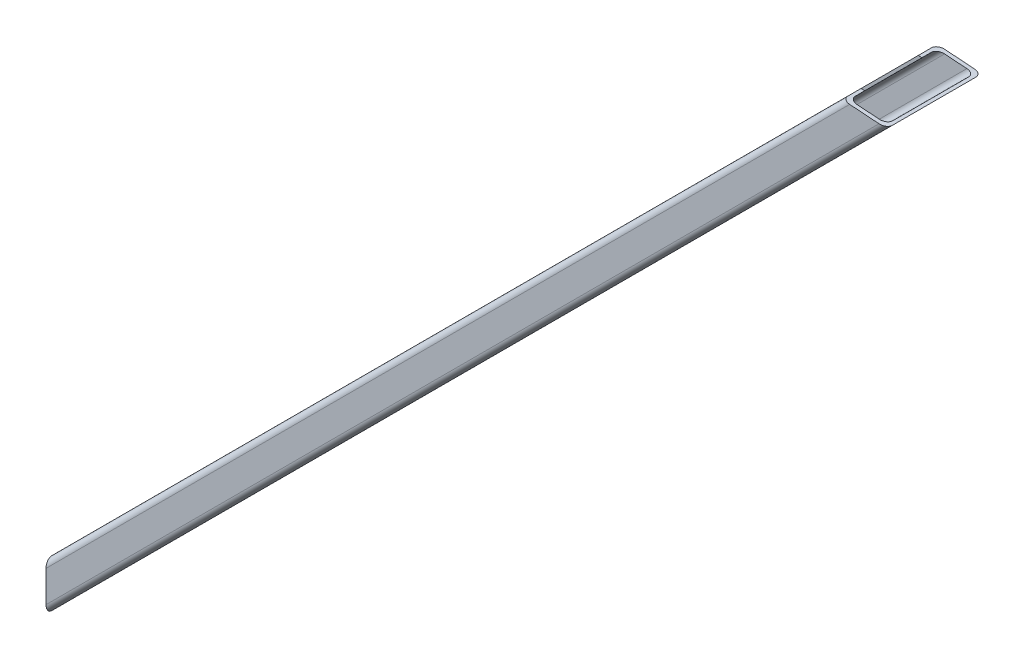
ISO-10303-21;
HEADER;
FILE_DESCRIPTION(('STEP AP214'),'2;1');
FILE_NAME('part.step','',(''),(''),'','','');
FILE_SCHEMA(('AUTOMOTIVE_DESIGN { 1 0 10303 214 1 1 1 1 }'));
ENDSEC;
DATA;
#1=APPLICATION_CONTEXT('core data for automotive mechanical design processes');
#2=APPLICATION_PROTOCOL_DEFINITION('international standard','automotive_design',2000,#1);
#3=PRODUCT_CONTEXT('',#1,'mechanical');
#4=PRODUCT('Part','Part','',(#3));
#5=PRODUCT_RELATED_PRODUCT_CATEGORY('part','',(#4));
#6=PRODUCT_DEFINITION_FORMATION('','',#4);
#7=PRODUCT_DEFINITION_CONTEXT('part definition',#1,'design');
#8=PRODUCT_DEFINITION('design','',#6,#7);
#9=PRODUCT_DEFINITION_SHAPE('','',#8);
#10=(LENGTH_UNIT() NAMED_UNIT(*) SI_UNIT(.MILLI.,.METRE.));
#11=(NAMED_UNIT(*) PLANE_ANGLE_UNIT() SI_UNIT($,.RADIAN.));
#12=(NAMED_UNIT(*) SI_UNIT($,.STERADIAN.) SOLID_ANGLE_UNIT());
#13=UNCERTAINTY_MEASURE_WITH_UNIT(LENGTH_MEASURE(1.E-05),#10,'distance_accuracy_value','');
#14=(GEOMETRIC_REPRESENTATION_CONTEXT(3) GLOBAL_UNCERTAINTY_ASSIGNED_CONTEXT((#13)) GLOBAL_UNIT_ASSIGNED_CONTEXT((#10,
#11,#12)) REPRESENTATION_CONTEXT('',''));
#15=CARTESIAN_POINT('',(0.,0.,0.));
#16=DIRECTION('',(0.,0.,1.));
#17=DIRECTION('',(1.,0.,0.));
#18=AXIS2_PLACEMENT_3D('',#15,#16,#17);
#19=CARTESIAN_POINT('',(951.319177060219,976.319177060221,-50.));
#20=DIRECTION('',(0.,0.,1.));
#21=DIRECTION('',(1.,0.,0.));
#22=AXIS2_PLACEMENT_3D('',#19,#20,#21);
#23=PLANE('',#22);
#24=DIRECTION('',(0.,1.,0.));
#25=VECTOR('',#24,1.);
#26=CARTESIAN_POINT('',(0.,25.,-50.));
#27=LINE('',#26,#25);
#28=CARTESIAN_POINT('',(0.,-16.5147186257614,-50.));
#29=VERTEX_POINT('',#28);
#30=CARTESIAN_POINT('',(0.,16.5147186257613,-50.));
#31=VERTEX_POINT('',#30);
#32=EDGE_CURVE('E201',#29,#31,#27,.T.);
#33=ORIENTED_EDGE('',*,*,#32,.T.);
#34=DIRECTION('',(-0.707106781186547,-0.707106781186549,0.));
#35=VECTOR('',#34,1.);
#36=CARTESIAN_POINT('',(955.561817747338,972.076536373102,-50.));
#37=LINE('',#36,#35);
#38=CARTESIAN_POINT('',(843.994443251335,860.509161877098,-50.));
#39=VERTEX_POINT('',#38);
#40=EDGE_CURVE('E260',#31,#39,#37,.F.);
#41=ORIENTED_EDGE('',*,*,#40,.T.);
#42=DIRECTION('',(-0.997546761100416,0.0700032814807309,0.));
#43=VECTOR('',#42,1.);
#44=CARTESIAN_POINT('',(942.706044073176,853.582031994864,-50.));
#45=LINE('',#44,#43);
#46=CARTESIAN_POINT('',(874.858015765053,858.343297139294,-50.));
#47=VERTEX_POINT('',#46);
#48=EDGE_CURVE('E183',#47,#39,#45,.T.);
#49=ORIENTED_EDGE('',*,*,#48,.F.);
#50=DIRECTION('',(-0.707106781186547,-0.707106781186549,0.));
#51=VECTOR('',#50,1.);
#52=CARTESIAN_POINT('',(972.076536373099,955.561817747341,-50.));
#53=LINE('',#52,#51);
#54=EDGE_CURVE('E257',#47,#29,#53,.T.);
#55=ORIENTED_EDGE('',*,*,#54,.T.);
#56=EDGE_LOOP('',(#33,#41,#49,#55));
#57=FACE_BOUND('',#56,.T.);
#58=ADVANCED_FACE('F33',(#57),#23,.F.);
#59=CARTESIAN_POINT('',(951.319177060219,976.319177060221,-30.));
#60=DIRECTION('',(0.707106781186549,-0.707106781186547,0.));
#61=DIRECTION('',(0.707106781186547,0.707106781186549,0.));
#62=AXIS2_PLACEMENT_3D('',#59,#60,#61);
#63=PLANE('',#62);
#64=DIRECTION('',(0.,0.,1.));
#65=VECTOR('',#64,1.);
#66=CARTESIAN_POINT('',(836.065573770489,861.065573770491,-29.9999999999999));
#67=LINE('',#66,#65);
#68=CARTESIAN_POINT('',(836.065573770489,861.065573770491,-44.));
#69=VERTEX_POINT('',#68);
#70=CARTESIAN_POINT('',(836.065573770489,861.065573770491,-30.));
#71=VERTEX_POINT('',#70);
#72=EDGE_CURVE('E170',#69,#71,#67,.T.);
#73=ORIENTED_EDGE('',*,*,#72,.F.);
#74=DIRECTION('',(-0.707106781186547,-0.707106781186549,0.));
#75=VECTOR('',#74,1.);
#76=CARTESIAN_POINT('',(951.319177060219,976.319177060221,-44.));
#77=LINE('',#76,#75);
#78=CARTESIAN_POINT('',(0.,25.,-44.));
#79=VERTEX_POINT('',#78);
#80=EDGE_CURVE('E255',#69,#79,#77,.T.);
#81=ORIENTED_EDGE('',*,*,#80,.T.);
#82=DIRECTION('',(0.,0.,1.));
#83=VECTOR('',#82,1.);
#84=CARTESIAN_POINT('',(0.,25.,-30.));
#85=LINE('',#84,#83);
#86=CARTESIAN_POINT('',(0.,25.,-30.));
#87=VERTEX_POINT('',#86);
#88=EDGE_CURVE('E197',#79,#87,#85,.T.);
#89=ORIENTED_EDGE('',*,*,#88,.T.);
#90=DIRECTION('',(-0.707106781186547,-0.707106781186549,0.));
#91=VECTOR('',#90,1.);
#92=CARTESIAN_POINT('',(951.319177060219,976.319177060221,-30.));
#93=LINE('',#92,#91);
#94=EDGE_CURVE('E190',#71,#87,#93,.T.);
#95=ORIENTED_EDGE('',*,*,#94,.F.);
#96=EDGE_LOOP('',(#73,#81,#89,#95));
#97=FACE_BOUND('',#96,.T.);
#98=ADVANCED_FACE('F195',(#97),#63,.F.);
#99=CARTESIAN_POINT('',(951.319177060219,976.319177060221,-30.));
#100=DIRECTION('',(0.,0.,-1.));
#101=DIRECTION('',(-1.,0.,0.));
#102=AXIS2_PLACEMENT_3D('',#99,#100,#101);
#103=PLANE('',#102);
#104=DIRECTION('',(0.997546761100416,-0.0700032814807309,0.));
#105=VECTOR('',#104,1.);
#106=CARTESIAN_POINT('',(942.706044073176,853.582031994864,-30.));
#107=LINE('',#106,#105);
#108=CARTESIAN_POINT('',(839.803278688521,860.803278688524,-30.));
#109=VERTEX_POINT('',#108);
#110=EDGE_CURVE('E175',#71,#109,#107,.T.);
#111=ORIENTED_EDGE('',*,*,#110,.F.);
#112=ORIENTED_EDGE('',*,*,#94,.T.);
#113=DIRECTION('',(0.,-1.,0.));
#114=VECTOR('',#113,1.);
#115=CARTESIAN_POINT('',(0.,25.,-30.));
#116=LINE('',#115,#114);
#117=CARTESIAN_POINT('',(0.,21.,-30.));
#118=VERTEX_POINT('',#117);
#119=EDGE_CURVE('E198',#87,#118,#116,.T.);
#120=ORIENTED_EDGE('',*,*,#119,.T.);
#121=DIRECTION('',(-0.707106781186547,-0.707106781186549,0.));
#122=VECTOR('',#121,1.);
#123=CARTESIAN_POINT('',(951.319177060219,972.319177060221,-30.));
#124=LINE('',#123,#122);
#125=EDGE_CURVE('E192',#109,#118,#124,.T.);
#126=ORIENTED_EDGE('',*,*,#125,.F.);
#127=EDGE_LOOP('',(#111,#112,#120,#126));
#128=FACE_BOUND('',#127,.T.);
#129=ADVANCED_FACE('F188',(#128),#103,.F.);
#130=CARTESIAN_POINT('',(951.319177060219,972.319177060221,-30.));
#131=DIRECTION('',(-0.707106781186549,0.707106781186547,0.));
#132=DIRECTION('',(-0.707106781186547,-0.707106781186549,0.));
#133=AXIS2_PLACEMENT_3D('',#130,#131,#132);
#134=PLANE('',#133);
#135=DIRECTION('',(0.,0.,-1.));
#136=VECTOR('',#135,1.);
#137=CARTESIAN_POINT('',(0.,21.,-30.));
#138=LINE('',#137,#136);
#139=CARTESIAN_POINT('',(0.,21.,-40.));
#140=VERTEX_POINT('',#139);
#141=EDGE_CURVE('E208',#118,#140,#138,.T.);
#142=ORIENTED_EDGE('',*,*,#141,.T.);
#143=DIRECTION('',(-0.707106781186547,-0.707106781186549,0.));
#144=VECTOR('',#143,1.);
#145=CARTESIAN_POINT('',(839.803278688521,860.803278688524,-40.));
#146=LINE('',#145,#144);
#147=CARTESIAN_POINT('',(839.803278688521,860.803278688524,-40.));
#148=VERTEX_POINT('',#147);
#149=EDGE_CURVE('E223',#140,#148,#146,.F.);
#150=ORIENTED_EDGE('',*,*,#149,.T.);
#151=DIRECTION('',(0.,0.,-1.));
#152=VECTOR('',#151,1.);
#153=CARTESIAN_POINT('',(839.803278688521,860.803278688524,-29.9999999999999));
#154=LINE('',#153,#152);
#155=EDGE_CURVE('E193',#109,#148,#154,.T.);
#156=ORIENTED_EDGE('',*,*,#155,.F.);
#157=ORIENTED_EDGE('',*,*,#125,.T.);
#158=EDGE_LOOP('',(#142,#150,#156,#157));
#159=FACE_BOUND('',#158,.T.);
#160=ADVANCED_FACE('F383',(#159),#134,.F.);
#161=CARTESIAN_POINT('',(951.319177060219,972.319177060221,-46.));
#162=DIRECTION('',(0.,0.,-1.));
#163=DIRECTION('',(-1.,0.,0.));
#164=AXIS2_PLACEMENT_3D('',#161,#162,#163);
#165=PLANE('',#164);
#166=DIRECTION('',(0.997546761100416,-0.0700032814807309,0.));
#167=VECTOR('',#166,1.);
#168=CARTESIAN_POINT('',(942.985370260006,853.562430157192,-46.));
#169=LINE('',#168,#167);
#170=CARTESIAN_POINT('',(847.732148169367,860.246866795131,-46.));
#171=VERTEX_POINT('',#170);
#172=CARTESIAN_POINT('',(871.12031084702,858.605592221261,-46.));
#173=VERTEX_POINT('',#172);
#174=EDGE_CURVE('E309',#171,#173,#169,.T.);
#175=ORIENTED_EDGE('',*,*,#174,.F.);
#176=DIRECTION('',(-0.707106781186547,-0.707106781186549,0.));
#177=VECTOR('',#176,1.);
#178=CARTESIAN_POINT('',(4.24264068711932,16.7573593128807,-46.));
#179=LINE('',#178,#177);
#180=CARTESIAN_POINT('',(0.,12.5147186257614,-46.));
#181=VERTEX_POINT('',#180);
#182=EDGE_CURVE('E219',#171,#181,#179,.T.);
#183=ORIENTED_EDGE('',*,*,#182,.T.);
#184=DIRECTION('',(0.,-1.,0.));
#185=VECTOR('',#184,1.);
#186=CARTESIAN_POINT('',(0.,21.,-46.));
#187=LINE('',#186,#185);
#188=CARTESIAN_POINT('',(0.,-12.5147186257614,-46.));
#189=VERTEX_POINT('',#188);
#190=EDGE_CURVE('E293',#181,#189,#187,.T.);
#191=ORIENTED_EDGE('',*,*,#190,.T.);
#192=DIRECTION('',(-0.707106781186547,-0.707106781186549,0.));
#193=VECTOR('',#192,1.);
#194=CARTESIAN_POINT('',(874.806539640746,862.291821014987,-46.));
#195=LINE('',#194,#193);
#196=EDGE_CURVE('E217',#189,#173,#195,.F.);
#197=ORIENTED_EDGE('',*,*,#196,.T.);
#198=EDGE_LOOP('',(#175,#183,#191,#197));
#199=FACE_BOUND('',#198,.T.);
#200=ADVANCED_FACE('F390',(#199),#165,.F.);
#201=CARTESIAN_POINT('',(951.319177060219,930.319177060221,46.));
#202=DIRECTION('',(0.707106781186549,-0.707106781186547,0.));
#203=DIRECTION('',(0.707106781186547,0.707106781186549,0.));
#204=AXIS2_PLACEMENT_3D('',#201,#202,#203);
#205=PLANE('',#204);
#206=DIRECTION('',(0.,0.,1.));
#207=VECTOR('',#206,1.);
#208=CARTESIAN_POINT('',(879.049180327866,858.049180327868,46.));
#209=LINE('',#208,#207);
#210=CARTESIAN_POINT('',(879.049180327866,858.049180327868,-40.));
#211=VERTEX_POINT('',#210);
#212=CARTESIAN_POINT('',(879.049180327866,858.049180327868,40.));
#213=VERTEX_POINT('',#212);
#214=EDGE_CURVE('E301',#211,#213,#209,.T.);
#215=ORIENTED_EDGE('',*,*,#214,.F.);
#216=DIRECTION('',(-0.707106781186547,-0.707106781186549,0.));
#217=VECTOR('',#216,1.);
#218=CARTESIAN_POINT('',(0.,-21.0000000000001,-40.));
#219=LINE('',#218,#217);
#220=CARTESIAN_POINT('',(0.,-21.,-40.));
#221=VERTEX_POINT('',#220);
#222=EDGE_CURVE('E268',#211,#221,#219,.T.);
#223=ORIENTED_EDGE('',*,*,#222,.T.);
#224=DIRECTION('',(0.,0.,1.));
#225=VECTOR('',#224,1.);
#226=CARTESIAN_POINT('',(0.,-21.,46.));
#227=LINE('',#226,#225);
#228=CARTESIAN_POINT('',(0.,-21.,40.));
#229=VERTEX_POINT('',#228);
#230=EDGE_CURVE('E286',#221,#229,#227,.T.);
#231=ORIENTED_EDGE('',*,*,#230,.T.);
#232=DIRECTION('',(-0.707106781186547,-0.707106781186549,0.));
#233=VECTOR('',#232,1.);
#234=CARTESIAN_POINT('',(879.049180327866,858.049180327868,40.));
#235=LINE('',#234,#233);
#236=EDGE_CURVE('E48',#229,#213,#235,.F.);
#237=ORIENTED_EDGE('',*,*,#236,.T.);
#238=EDGE_LOOP('',(#215,#223,#231,#237));
#239=FACE_BOUND('',#238,.T.);
#240=ADVANCED_FACE('F291',(#239),#205,.F.);
#241=CARTESIAN_POINT('',(951.319177060219,972.319177060221,46.));
#242=DIRECTION('',(0.,0.,1.));
#243=DIRECTION('',(1.,0.,0.));
#244=AXIS2_PLACEMENT_3D('',#241,#242,#243);
#245=PLANE('',#244);
#246=DIRECTION('',(0.,1.,0.));
#247=VECTOR('',#246,1.);
#248=CARTESIAN_POINT('',(0.,21.,46.));
#249=LINE('',#248,#247);
#250=CARTESIAN_POINT('',(0.,-12.5147186257615,46.));
#251=VERTEX_POINT('',#250);
#252=CARTESIAN_POINT('',(0.,12.5147186257613,46.));
#253=VERTEX_POINT('',#252);
#254=EDGE_CURVE('E288',#251,#253,#249,.T.);
#255=ORIENTED_EDGE('',*,*,#254,.T.);
#256=DIRECTION('',(-0.707106781186547,-0.707106781186549,0.));
#257=VECTOR('',#256,1.);
#258=CARTESIAN_POINT('',(844.045919375641,856.560638001405,46.));
#259=LINE('',#258,#257);
#260=CARTESIAN_POINT('',(847.732148169367,860.246866795131,46.));
#261=VERTEX_POINT('',#260);
#262=EDGE_CURVE('E231',#253,#261,#259,.F.);
#263=ORIENTED_EDGE('',*,*,#262,.T.);
#264=DIRECTION('',(-0.997546761100416,0.0700032814807309,0.));
#265=VECTOR('',#264,1.);
#266=CARTESIAN_POINT('',(942.985370260006,853.562430157192,46.));
#267=LINE('',#266,#265);
#268=CARTESIAN_POINT('',(871.12031084702,858.605592221261,46.));
#269=VERTEX_POINT('',#268);
#270=EDGE_CURVE('E299',#269,#261,#267,.T.);
#271=ORIENTED_EDGE('',*,*,#270,.F.);
#272=DIRECTION('',(-0.707106781186547,-0.707106781186549,0.));
#273=VECTOR('',#272,1.);
#274=CARTESIAN_POINT('',(-4.24264068711944,-16.7573593128809,46.));
#275=LINE('',#274,#273);
#276=EDGE_CURVE('E228',#269,#251,#275,.T.);
#277=ORIENTED_EDGE('',*,*,#276,.T.);
#278=EDGE_LOOP('',(#255,#263,#271,#277));
#279=FACE_BOUND('',#278,.T.);
#280=ADVANCED_FACE('F303',(#279),#245,.F.);
#281=CARTESIAN_POINT('',(951.319177060219,972.319177060221,46.));
#282=DIRECTION('',(-0.707106781186549,0.707106781186547,0.));
#283=DIRECTION('',(-0.707106781186547,-0.707106781186549,0.));
#284=AXIS2_PLACEMENT_3D('',#281,#282,#283);
#285=PLANE('',#284);
#286=DIRECTION('',(0.,0.,-1.));
#287=VECTOR('',#286,1.);
#288=CARTESIAN_POINT('',(839.803278688521,860.803278688524,46.0000000000001));
#289=LINE('',#288,#287);
#290=CARTESIAN_POINT('',(839.803278688521,860.803278688524,40.));
#291=VERTEX_POINT('',#290);
#292=CARTESIAN_POINT('',(839.803278688522,860.803278688524,30.));
#293=VERTEX_POINT('',#292);
#294=EDGE_CURVE('E305',#291,#293,#289,.T.);
#295=ORIENTED_EDGE('',*,*,#294,.F.);
#296=DIRECTION('',(-0.707106781186547,-0.707106781186549,0.));
#297=VECTOR('',#296,1.);
#298=CARTESIAN_POINT('',(0.,21.0000000000001,40.));
#299=LINE('',#298,#297);
#300=CARTESIAN_POINT('',(0.,21.,40.));
#301=VERTEX_POINT('',#300);
#302=EDGE_CURVE('E225',#291,#301,#299,.T.);
#303=ORIENTED_EDGE('',*,*,#302,.T.);
#304=DIRECTION('',(0.,0.,-1.));
#305=VECTOR('',#304,1.);
#306=CARTESIAN_POINT('',(0.,21.,46.));
#307=LINE('',#306,#305);
#308=CARTESIAN_POINT('',(0.,21.,30.));
#309=VERTEX_POINT('',#308);
#310=EDGE_CURVE('E213',#301,#309,#307,.T.);
#311=ORIENTED_EDGE('',*,*,#310,.T.);
#312=DIRECTION('',(-0.707106781186547,-0.707106781186549,0.));
#313=VECTOR('',#312,1.);
#314=CARTESIAN_POINT('',(951.319177060219,972.319177060221,30.));
#315=LINE('',#314,#313);
#316=EDGE_CURVE('E209',#293,#309,#315,.T.);
#317=ORIENTED_EDGE('',*,*,#316,.F.);
#318=EDGE_LOOP('',(#295,#303,#311,#317));
#319=FACE_BOUND('',#318,.T.);
#320=ADVANCED_FACE('F353',(#319),#285,.F.);
#321=CARTESIAN_POINT('',(951.319177060219,976.319177060221,30.));
#322=DIRECTION('',(0.,0.,1.));
#323=DIRECTION('',(1.,0.,0.));
#324=AXIS2_PLACEMENT_3D('',#321,#322,#323);
#325=PLANE('',#324);
#326=DIRECTION('',(-0.997546761100416,0.0700032814807309,0.));
#327=VECTOR('',#326,1.);
#328=CARTESIAN_POINT('',(942.706044073176,853.582031994864,30.));
#329=LINE('',#328,#327);
#330=CARTESIAN_POINT('',(836.065573770489,861.065573770491,30.));
#331=VERTEX_POINT('',#330);
#332=EDGE_CURVE('E307',#293,#331,#329,.T.);
#333=ORIENTED_EDGE('',*,*,#332,.F.);
#334=ORIENTED_EDGE('',*,*,#316,.T.);
#335=DIRECTION('',(0.,1.,0.));
#336=VECTOR('',#335,1.);
#337=CARTESIAN_POINT('',(0.,25.,30.));
#338=LINE('',#337,#336);
#339=CARTESIAN_POINT('',(0.,25.,30.));
#340=VERTEX_POINT('',#339);
#341=EDGE_CURVE('E212',#309,#340,#338,.T.);
#342=ORIENTED_EDGE('',*,*,#341,.T.);
#343=DIRECTION('',(-0.707106781186547,-0.707106781186549,0.));
#344=VECTOR('',#343,1.);
#345=CARTESIAN_POINT('',(951.319177060219,976.319177060221,30.));
#346=LINE('',#345,#344);
#347=EDGE_CURVE('E214',#331,#340,#346,.T.);
#348=ORIENTED_EDGE('',*,*,#347,.F.);
#349=EDGE_LOOP('',(#333,#334,#342,#348));
#350=FACE_BOUND('',#349,.T.);
#351=ADVANCED_FACE('F350',(#350),#325,.F.);
#352=CARTESIAN_POINT('',(951.319177060219,976.319177060221,50.));
#353=DIRECTION('',(0.707106781186549,-0.707106781186547,0.));
#354=DIRECTION('',(0.707106781186547,0.707106781186549,0.));
#355=AXIS2_PLACEMENT_3D('',#352,#353,#354);
#356=PLANE('',#355);
#357=DIRECTION('',(0.,0.,1.));
#358=VECTOR('',#357,1.);
#359=CARTESIAN_POINT('',(0.,25.,50.));
#360=LINE('',#359,#358);
#361=CARTESIAN_POINT('',(0.,25.,44.));
#362=VERTEX_POINT('',#361);
#363=EDGE_CURVE('E216',#340,#362,#360,.T.);
#364=ORIENTED_EDGE('',*,*,#363,.T.);
#365=DIRECTION('',(-0.707106781186547,-0.707106781186549,0.));
#366=VECTOR('',#365,1.);
#367=CARTESIAN_POINT('',(951.319177060219,976.319177060221,44.));
#368=LINE('',#367,#366);
#369=CARTESIAN_POINT('',(836.065573770489,861.065573770491,44.));
#370=VERTEX_POINT('',#369);
#371=EDGE_CURVE('E246',#362,#370,#368,.F.);
#372=ORIENTED_EDGE('',*,*,#371,.T.);
#373=DIRECTION('',(0.,0.,1.));
#374=VECTOR('',#373,1.);
#375=CARTESIAN_POINT('',(836.065573770489,861.065573770491,50.0000000000001));
#376=LINE('',#375,#374);
#377=EDGE_CURVE('E342',#331,#370,#376,.T.);
#378=ORIENTED_EDGE('',*,*,#377,.F.);
#379=ORIENTED_EDGE('',*,*,#347,.T.);
#380=EDGE_LOOP('',(#364,#372,#378,#379));
#381=FACE_BOUND('',#380,.T.);
#382=ADVANCED_FACE('F359',(#381),#356,.F.);
#383=CARTESIAN_POINT('',(951.319177060219,976.319177060221,50.));
#384=DIRECTION('',(0.,0.,-1.));
#385=DIRECTION('',(-1.,0.,0.));
#386=AXIS2_PLACEMENT_3D('',#383,#384,#385);
#387=PLANE('',#386);
#388=DIRECTION('',(0.997546761100416,-0.0700032814807309,0.));
#389=VECTOR('',#388,1.);
#390=CARTESIAN_POINT('',(942.706044073176,853.582031994864,50.));
#391=LINE('',#390,#389);
#392=CARTESIAN_POINT('',(843.994443251335,860.509161877098,50.));
#393=VERTEX_POINT('',#392);
#394=CARTESIAN_POINT('',(874.858015765053,858.343297139294,50.));
#395=VERTEX_POINT('',#394);
#396=EDGE_CURVE('E220',#393,#395,#391,.T.);
#397=ORIENTED_EDGE('',*,*,#396,.F.);
#398=DIRECTION('',(-0.707106781186547,-0.707106781186549,0.));
#399=VECTOR('',#398,1.);
#400=CARTESIAN_POINT('',(955.561817747338,972.076536373102,50.));
#401=LINE('',#400,#399);
#402=CARTESIAN_POINT('',(0.,16.5147186257614,50.));
#403=VERTEX_POINT('',#402);
#404=EDGE_CURVE('E235',#393,#403,#401,.T.);
#405=ORIENTED_EDGE('',*,*,#404,.T.);
#406=DIRECTION('',(0.,-1.,0.));
#407=VECTOR('',#406,1.);
#408=CARTESIAN_POINT('',(0.,25.,50.));
#409=LINE('',#408,#407);
#410=CARTESIAN_POINT('',(0.,-16.5147186257614,50.));
#411=VERTEX_POINT('',#410);
#412=EDGE_CURVE('E320',#403,#411,#409,.T.);
#413=ORIENTED_EDGE('',*,*,#412,.T.);
#414=DIRECTION('',(-0.707106781186547,-0.707106781186549,0.));
#415=VECTOR('',#414,1.);
#416=CARTESIAN_POINT('',(972.076536373099,955.561817747341,50.));
#417=LINE('',#416,#415);
#418=EDGE_CURVE('E233',#411,#395,#417,.F.);
#419=ORIENTED_EDGE('',*,*,#418,.T.);
#420=EDGE_LOOP('',(#397,#405,#413,#419));
#421=FACE_BOUND('',#420,.T.);
#422=ADVANCED_FACE('F366',(#421),#387,.F.);
#423=CARTESIAN_POINT('',(951.319177060219,926.319177060221,50.));
#424=DIRECTION('',(-0.707106781186549,0.707106781186547,0.));
#425=DIRECTION('',(-0.707106781186547,-0.707106781186549,0.));
#426=AXIS2_PLACEMENT_3D('',#423,#424,#425);
#427=PLANE('',#426);
#428=DIRECTION('',(0.,0.,-1.));
#429=VECTOR('',#428,1.);
#430=CARTESIAN_POINT('',(0.,-25.,50.));
#431=LINE('',#430,#429);
#432=CARTESIAN_POINT('',(0.,-25.,44.));
#433=VERTEX_POINT('',#432);
#434=CARTESIAN_POINT('',(0.,-25.,-44.));
#435=VERTEX_POINT('',#434);
#436=EDGE_CURVE('E316',#433,#435,#431,.T.);
#437=ORIENTED_EDGE('',*,*,#436,.T.);
#438=DIRECTION('',(-0.707106781186547,-0.707106781186549,0.));
#439=VECTOR('',#438,1.);
#440=CARTESIAN_POINT('',(951.319177060219,926.319177060221,-44.));
#441=LINE('',#440,#439);
#442=CARTESIAN_POINT('',(882.786885245899,857.786885245901,-44.));
#443=VERTEX_POINT('',#442);
#444=EDGE_CURVE('E265',#435,#443,#441,.F.);
#445=ORIENTED_EDGE('',*,*,#444,.T.);
#446=DIRECTION('',(0.,0.,-1.));
#447=VECTOR('',#446,1.);
#448=CARTESIAN_POINT('',(882.786885245899,857.786885245901,50.));
#449=LINE('',#448,#447);
#450=CARTESIAN_POINT('',(882.786885245899,857.786885245901,44.));
#451=VERTEX_POINT('',#450);
#452=EDGE_CURVE('E205',#451,#443,#449,.T.);
#453=ORIENTED_EDGE('',*,*,#452,.F.);
#454=DIRECTION('',(-0.707106781186547,-0.707106781186549,0.));
#455=VECTOR('',#454,1.);
#456=CARTESIAN_POINT('',(951.319177060219,926.319177060221,44.));
#457=LINE('',#456,#455);
#458=EDGE_CURVE('E262',#451,#433,#457,.T.);
#459=ORIENTED_EDGE('',*,*,#458,.T.);
#460=EDGE_LOOP('',(#437,#445,#453,#459));
#461=FACE_BOUND('',#460,.T.);
#462=ADVANCED_FACE('F370',(#461),#427,.F.);
#463=CARTESIAN_POINT('',(0.,0.,0.));
#464=DIRECTION('',(1.,0.,0.));
#465=DIRECTION('',(0.,0.,-1.));
#466=AXIS2_PLACEMENT_3D('',#463,#464,#465);
#467=PLANE('',#466);
#468=ORIENTED_EDGE('',*,*,#412,.F.);
#469=CARTESIAN_POINT('',(0.,16.5147186257614,44.));
#470=DIRECTION('',(1.,0.,0.));
#471=DIRECTION('',(0.,-1.,0.));
#472=AXIS2_PLACEMENT_3D('',#469,#470,#471);
#473=ELLIPSE('',#472,8.48528137423858,6.);
#474=EDGE_CURVE('E244',#403,#362,#473,.F.);
#475=ORIENTED_EDGE('',*,*,#474,.T.);
#476=ORIENTED_EDGE('',*,*,#363,.F.);
#477=ORIENTED_EDGE('',*,*,#341,.F.);
#478=ORIENTED_EDGE('',*,*,#310,.F.);
#479=CARTESIAN_POINT('',(0.,12.5147186257614,40.));
#480=DIRECTION('',(1.,0.,0.));
#481=DIRECTION('',(0.,1.,0.));
#482=AXIS2_PLACEMENT_3D('',#479,#480,#481);
#483=ELLIPSE('',#482,8.48528137423858,6.);
#484=EDGE_CURVE('E275',#301,#253,#483,.T.);
#485=ORIENTED_EDGE('',*,*,#484,.T.);
#486=ORIENTED_EDGE('',*,*,#254,.F.);
#487=CARTESIAN_POINT('',(0.,-12.5147186257615,40.));
#488=DIRECTION('',(1.,0.,0.));
#489=DIRECTION('',(0.,1.,0.));
#490=AXIS2_PLACEMENT_3D('',#487,#488,#489);
#491=ELLIPSE('',#490,8.48528137423858,6.);
#492=EDGE_CURVE('E41',#251,#229,#491,.T.);
#493=ORIENTED_EDGE('',*,*,#492,.T.);
#494=ORIENTED_EDGE('',*,*,#230,.F.);
#495=CARTESIAN_POINT('',(-1.11022302462516E-13,-12.5147186257615,-40.));
#496=DIRECTION('',(1.,0.,0.));
#497=DIRECTION('',(0.,1.,0.));
#498=AXIS2_PLACEMENT_3D('',#495,#496,#497);
#499=ELLIPSE('',#498,8.48528137423858,6.);
#500=EDGE_CURVE('E279',#221,#189,#499,.T.);
#501=ORIENTED_EDGE('',*,*,#500,.T.);
#502=ORIENTED_EDGE('',*,*,#190,.F.);
#503=CARTESIAN_POINT('',(0.,12.5147186257614,-40.));
#504=DIRECTION('',(1.,0.,0.));
#505=DIRECTION('',(0.,1.,0.));
#506=AXIS2_PLACEMENT_3D('',#503,#504,#505);
#507=ELLIPSE('',#506,8.48528137423858,6.);
#508=EDGE_CURVE('E271',#181,#140,#507,.T.);
#509=ORIENTED_EDGE('',*,*,#508,.T.);
#510=ORIENTED_EDGE('',*,*,#141,.F.);
#511=ORIENTED_EDGE('',*,*,#119,.F.);
#512=ORIENTED_EDGE('',*,*,#88,.F.);
#513=CARTESIAN_POINT('',(0.,16.5147186257614,-44.));
#514=DIRECTION('',(1.,0.,0.));
#515=DIRECTION('',(0.,-1.,0.));
#516=AXIS2_PLACEMENT_3D('',#513,#514,#515);
#517=ELLIPSE('',#516,8.48528137423858,6.);
#518=EDGE_CURVE('E242',#79,#31,#517,.F.);
#519=ORIENTED_EDGE('',*,*,#518,.T.);
#520=ORIENTED_EDGE('',*,*,#32,.F.);
#521=CARTESIAN_POINT('',(0.,-16.5147186257613,-44.));
#522=DIRECTION('',(1.,0.,0.));
#523=DIRECTION('',(0.,-1.,0.));
#524=AXIS2_PLACEMENT_3D('',#521,#522,#523);
#525=ELLIPSE('',#524,8.48528137423858,6.);
#526=EDGE_CURVE('E240',#29,#435,#525,.F.);
#527=ORIENTED_EDGE('',*,*,#526,.T.);
#528=ORIENTED_EDGE('',*,*,#436,.F.);
#529=CARTESIAN_POINT('',(-1.11022302462516E-13,-16.5147186257615,44.));
#530=DIRECTION('',(1.,0.,0.));
#531=DIRECTION('',(0.,-1.,0.));
#532=AXIS2_PLACEMENT_3D('',#529,#530,#531);
#533=ELLIPSE('',#532,8.48528137423858,6.);
#534=EDGE_CURVE('E238',#433,#411,#533,.F.);
#535=ORIENTED_EDGE('',*,*,#534,.T.);
#536=EDGE_LOOP('',(#468,#475,#476,#477,#478,#485,#486,#493,#494,#501,#502,#509,#510,#511,#512,
#519,#520,#527,#528,#535));
#537=FACE_BOUND('',#536,.T.);
#538=ADVANCED_FACE('F285',(#537),#467,.F.);
#539=CARTESIAN_POINT('',(5767.64028330125,514.990155557806,-50.));
#540=DIRECTION('',(0.0700032814807309,0.997546761100416,0.));
#541=DIRECTION('',(0.,0.,1.));
#542=AXIS2_PLACEMENT_3D('',#539,#540,#541);
#543=PLANE('',#542);
#544=ORIENTED_EDGE('',*,*,#377,.T.);
#545=CARTESIAN_POINT('',(843.994443251335,860.509161877098,44.));
#546=DIRECTION('',(0.0700032814807309,0.997546761100416,0.));
#547=DIRECTION('',(-0.997546761100416,0.0700032814807309,0.));
#548=AXIS2_PLACEMENT_3D('',#545,#546,#547);
#549=ELLIPSE('',#548,7.94836872819812,6.);
#550=EDGE_CURVE('E253',#370,#393,#549,.T.);
#551=ORIENTED_EDGE('',*,*,#550,.T.);
#552=ORIENTED_EDGE('',*,*,#396,.T.);
#553=CARTESIAN_POINT('',(874.858015765053,858.343297139294,44.));
#554=DIRECTION('',(0.0700032814807309,0.997546761100416,0.));
#555=DIRECTION('',(-0.997546761100416,0.0700032814807309,0.));
#556=AXIS2_PLACEMENT_3D('',#553,#554,#555);
#557=ELLIPSE('',#556,7.94836872819812,6.);
#558=EDGE_CURVE('E248',#395,#451,#557,.T.);
#559=ORIENTED_EDGE('',*,*,#558,.T.);
#560=ORIENTED_EDGE('',*,*,#452,.T.);
#561=CARTESIAN_POINT('',(874.858015765053,858.343297139294,-44.));
#562=DIRECTION('',(0.0700032814807309,0.997546761100416,0.));
#563=DIRECTION('',(-0.997546761100416,0.0700032814807309,0.));
#564=AXIS2_PLACEMENT_3D('',#561,#562,#563);
#565=ELLIPSE('',#564,7.94836872819812,6.);
#566=EDGE_CURVE('E250',#443,#47,#565,.T.);
#567=ORIENTED_EDGE('',*,*,#566,.T.);
#568=ORIENTED_EDGE('',*,*,#48,.T.);
#569=CARTESIAN_POINT('',(843.994443251335,860.509161877098,-44.));
#570=DIRECTION('',(0.0700032814807309,0.997546761100416,0.));
#571=DIRECTION('',(-0.997546761100416,0.0700032814807309,0.));
#572=AXIS2_PLACEMENT_3D('',#569,#570,#571);
#573=ELLIPSE('',#572,7.94836872819812,6.);
#574=EDGE_CURVE('E178',#39,#69,#573,.T.);
#575=ORIENTED_EDGE('',*,*,#574,.T.);
#576=ORIENTED_EDGE('',*,*,#72,.T.);
#577=ORIENTED_EDGE('',*,*,#110,.T.);
#578=ORIENTED_EDGE('',*,*,#155,.T.);
#579=CARTESIAN_POINT('',(847.732148169368,860.246866795131,-40.));
#580=DIRECTION('',(0.0700032814807309,0.997546761100416,0.));
#581=DIRECTION('',(0.997546761100416,-0.0700032814807309,0.));
#582=AXIS2_PLACEMENT_3D('',#579,#580,#581);
#583=ELLIPSE('',#582,7.94836872819812,6.);
#584=EDGE_CURVE('E273',#148,#171,#583,.F.);
#585=ORIENTED_EDGE('',*,*,#584,.T.);
#586=ORIENTED_EDGE('',*,*,#174,.T.);
#587=CARTESIAN_POINT('',(871.12031084702,858.605592221261,-40.));
#588=DIRECTION('',(0.0700032814807309,0.997546761100416,0.));
#589=DIRECTION('',(0.997546761100416,-0.0700032814807309,0.));
#590=AXIS2_PLACEMENT_3D('',#587,#588,#589);
#591=ELLIPSE('',#590,7.94836872819812,6.);
#592=EDGE_CURVE('E55',#173,#211,#591,.F.);
#593=ORIENTED_EDGE('',*,*,#592,.T.);
#594=ORIENTED_EDGE('',*,*,#214,.T.);
#595=CARTESIAN_POINT('',(871.12031084702,858.605592221261,40.));
#596=DIRECTION('',(0.0700032814807309,0.997546761100416,0.));
#597=DIRECTION('',(0.997546761100416,-0.0700032814807309,0.));
#598=AXIS2_PLACEMENT_3D('',#595,#596,#597);
#599=ELLIPSE('',#598,7.94836872819812,6.);
#600=EDGE_CURVE('E11',#213,#269,#599,.F.);
#601=ORIENTED_EDGE('',*,*,#600,.T.);
#602=ORIENTED_EDGE('',*,*,#270,.T.);
#603=CARTESIAN_POINT('',(847.732148169368,860.246866795131,40.));
#604=DIRECTION('',(0.0700032814807309,0.997546761100416,0.));
#605=DIRECTION('',(0.997546761100416,-0.0700032814807309,0.));
#606=AXIS2_PLACEMENT_3D('',#603,#604,#605);
#607=ELLIPSE('',#606,7.94836872819812,6.);
#608=EDGE_CURVE('E277',#261,#291,#607,.F.);
#609=ORIENTED_EDGE('',*,*,#608,.T.);
#610=ORIENTED_EDGE('',*,*,#294,.T.);
#611=ORIENTED_EDGE('',*,*,#332,.T.);
#612=EDGE_LOOP('',(#544,#551,#552,#559,#560,#567,#568,#575,#576,#577,#578,#585,#586,#593,#594,
#601,#602,#609,#610,#611));
#613=FACE_BOUND('',#612,.T.);
#614=ADVANCED_FACE('F173',(#613),#543,.T.);
#615=CARTESIAN_POINT('',(955.561817747338,968.076536373102,-40.));
#616=DIRECTION('',(0.707106781186547,0.707106781186549,0.));
#617=DIRECTION('',(-0.707106781186549,0.707106781186547,0.));
#618=AXIS2_PLACEMENT_3D('',#615,#616,#617);
#619=CYLINDRICAL_SURFACE('',#618,6.);
#620=ORIENTED_EDGE('',*,*,#584,.F.);
#621=ORIENTED_EDGE('',*,*,#149,.F.);
#622=ORIENTED_EDGE('',*,*,#508,.F.);
#623=ORIENTED_EDGE('',*,*,#182,.F.);
#624=EDGE_LOOP('',(#620,#621,#622,#623));
#625=FACE_BOUND('',#624,.T.);
#626=ADVANCED_FACE('F386',(#625),#619,.F.);
#627=CARTESIAN_POINT('',(955.561817747338,968.076536373102,40.));
#628=DIRECTION('',(0.707106781186547,0.707106781186549,0.));
#629=DIRECTION('',(-0.707106781186549,0.707106781186547,0.));
#630=AXIS2_PLACEMENT_3D('',#627,#628,#629);
#631=CYLINDRICAL_SURFACE('',#630,6.);
#632=ORIENTED_EDGE('',*,*,#608,.F.);
#633=ORIENTED_EDGE('',*,*,#262,.F.);
#634=ORIENTED_EDGE('',*,*,#484,.F.);
#635=ORIENTED_EDGE('',*,*,#302,.F.);
#636=EDGE_LOOP('',(#632,#633,#634,#635));
#637=FACE_BOUND('',#636,.T.);
#638=ADVANCED_FACE('F413',(#637),#631,.F.);
#639=CARTESIAN_POINT('',(955.561817747338,972.076536373102,44.));
#640=DIRECTION('',(-0.707106781186547,-0.707106781186549,0.));
#641=DIRECTION('',(0.707106781186549,-0.707106781186547,0.));
#642=AXIS2_PLACEMENT_3D('',#639,#640,#641);
#643=CYLINDRICAL_SURFACE('',#642,6.);
#644=ORIENTED_EDGE('',*,*,#550,.F.);
#645=ORIENTED_EDGE('',*,*,#371,.F.);
#646=ORIENTED_EDGE('',*,*,#474,.F.);
#647=ORIENTED_EDGE('',*,*,#404,.F.);
#648=EDGE_LOOP('',(#644,#645,#646,#647));
#649=FACE_BOUND('',#648,.T.);
#650=ADVANCED_FACE('F361',(#649),#643,.T.);
#651=CARTESIAN_POINT('',(955.561817747338,972.076536373102,-44.));
#652=DIRECTION('',(-0.707106781186547,-0.707106781186549,0.));
#653=DIRECTION('',(0.707106781186549,-0.707106781186547,0.));
#654=AXIS2_PLACEMENT_3D('',#651,#652,#653);
#655=CYLINDRICAL_SURFACE('',#654,6.);
#656=ORIENTED_EDGE('',*,*,#574,.F.);
#657=ORIENTED_EDGE('',*,*,#40,.F.);
#658=ORIENTED_EDGE('',*,*,#518,.F.);
#659=ORIENTED_EDGE('',*,*,#80,.F.);
#660=EDGE_LOOP('',(#656,#657,#658,#659));
#661=FACE_BOUND('',#660,.T.);
#662=ADVANCED_FACE('F378',(#661),#655,.T.);
#663=CARTESIAN_POINT('',(972.076536373099,955.561817747341,-44.));
#664=DIRECTION('',(-0.707106781186547,-0.707106781186549,0.));
#665=DIRECTION('',(0.707106781186549,-0.707106781186547,0.));
#666=AXIS2_PLACEMENT_3D('',#663,#664,#665);
#667=CYLINDRICAL_SURFACE('',#666,6.);
#668=ORIENTED_EDGE('',*,*,#566,.F.);
#669=ORIENTED_EDGE('',*,*,#444,.F.);
#670=ORIENTED_EDGE('',*,*,#526,.F.);
#671=ORIENTED_EDGE('',*,*,#54,.F.);
#672=EDGE_LOOP('',(#668,#669,#670,#671));
#673=FACE_BOUND('',#672,.T.);
#674=ADVANCED_FACE('F372',(#673),#667,.T.);
#675=CARTESIAN_POINT('',(947.076536373099,934.561817747341,-40.));
#676=DIRECTION('',(0.707106781186547,0.707106781186549,0.));
#677=DIRECTION('',(-0.707106781186549,0.707106781186547,0.));
#678=AXIS2_PLACEMENT_3D('',#675,#676,#677);
#679=CYLINDRICAL_SURFACE('',#678,6.);
#680=ORIENTED_EDGE('',*,*,#592,.F.);
#681=ORIENTED_EDGE('',*,*,#196,.F.);
#682=ORIENTED_EDGE('',*,*,#500,.F.);
#683=ORIENTED_EDGE('',*,*,#222,.F.);
#684=EDGE_LOOP('',(#680,#681,#682,#683));
#685=FACE_BOUND('',#684,.T.);
#686=ADVANCED_FACE('F393',(#685),#679,.F.);
#687=CARTESIAN_POINT('',(968.076536373099,955.561817747341,40.));
#688=DIRECTION('',(0.707106781186547,0.707106781186549,0.));
#689=DIRECTION('',(-0.707106781186549,0.707106781186547,0.));
#690=AXIS2_PLACEMENT_3D('',#687,#688,#689);
#691=CYLINDRICAL_SURFACE('',#690,6.);
#692=ORIENTED_EDGE('',*,*,#600,.F.);
#693=ORIENTED_EDGE('',*,*,#236,.F.);
#694=ORIENTED_EDGE('',*,*,#492,.F.);
#695=ORIENTED_EDGE('',*,*,#276,.F.);
#696=EDGE_LOOP('',(#692,#693,#694,#695));
#697=FACE_BOUND('',#696,.T.);
#698=ADVANCED_FACE('F296',(#697),#691,.F.);
#699=CARTESIAN_POINT('',(947.076536373099,930.561817747341,44.));
#700=DIRECTION('',(-0.707106781186547,-0.707106781186549,0.));
#701=DIRECTION('',(0.707106781186549,-0.707106781186547,0.));
#702=AXIS2_PLACEMENT_3D('',#699,#700,#701);
#703=CYLINDRICAL_SURFACE('',#702,6.);
#704=ORIENTED_EDGE('',*,*,#558,.F.);
#705=ORIENTED_EDGE('',*,*,#418,.F.);
#706=ORIENTED_EDGE('',*,*,#534,.F.);
#707=ORIENTED_EDGE('',*,*,#458,.F.);
#708=EDGE_LOOP('',(#704,#705,#706,#707));
#709=FACE_BOUND('',#708,.T.);
#710=ADVANCED_FACE('F35',(#709),#703,.T.);
#711=CLOSED_SHELL('',(#58,#98,#129,#160,#200,#240,#280,#320,#351,#382,#422,#462,#538,#614,#626,
#638,#650,#662,#674,#686,#698,#710));
#712=MANIFOLD_SOLID_BREP('B2',#711);
#713=ADVANCED_BREP_SHAPE_REPRESENTATION('',(#18,#712),#14);
#714=SHAPE_DEFINITION_REPRESENTATION(#9,#713);
ENDSEC;
END-ISO-10303-21;
